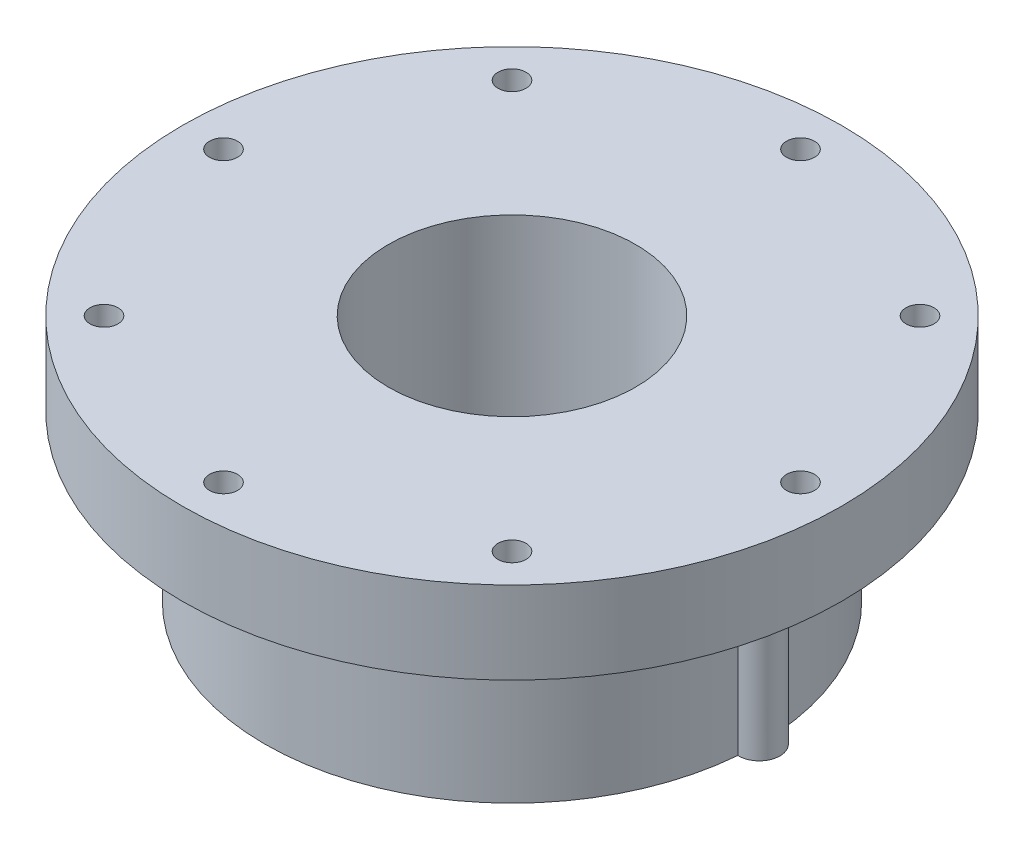
ISO-10303-21;
HEADER;
FILE_DESCRIPTION(('STEP AP214'),'2;1');
FILE_NAME('part.step','',(''),(''),'','','');
FILE_SCHEMA(('AUTOMOTIVE_DESIGN { 1 0 10303 214 1 1 1 1 }'));
ENDSEC;
DATA;
#1=APPLICATION_CONTEXT('core data for automotive mechanical design processes');
#2=APPLICATION_PROTOCOL_DEFINITION('international standard','automotive_design',2000,#1);
#3=PRODUCT_CONTEXT('',#1,'mechanical');
#4=PRODUCT('Part','Part','',(#3));
#5=PRODUCT_RELATED_PRODUCT_CATEGORY('part','',(#4));
#6=PRODUCT_DEFINITION_FORMATION('','',#4);
#7=PRODUCT_DEFINITION_CONTEXT('part definition',#1,'design');
#8=PRODUCT_DEFINITION('design','',#6,#7);
#9=PRODUCT_DEFINITION_SHAPE('','',#8);
#10=(LENGTH_UNIT() NAMED_UNIT(*) SI_UNIT(.MILLI.,.METRE.));
#11=(NAMED_UNIT(*) PLANE_ANGLE_UNIT() SI_UNIT($,.RADIAN.));
#12=(NAMED_UNIT(*) SI_UNIT($,.STERADIAN.) SOLID_ANGLE_UNIT());
#13=UNCERTAINTY_MEASURE_WITH_UNIT(LENGTH_MEASURE(1.E-05),#10,'distance_accuracy_value','');
#14=(GEOMETRIC_REPRESENTATION_CONTEXT(3) GLOBAL_UNCERTAINTY_ASSIGNED_CONTEXT((#13)) GLOBAL_UNIT_ASSIGNED_CONTEXT((#10,
#11,#12)) REPRESENTATION_CONTEXT('',''));
#15=CARTESIAN_POINT('',(0.,0.,0.));
#16=DIRECTION('',(0.,0.,1.));
#17=DIRECTION('',(1.,0.,0.));
#18=AXIS2_PLACEMENT_3D('',#15,#16,#17);
#19=CARTESIAN_POINT('',(15.,-10.,0.));
#20=DIRECTION('',(0.,1.,0.));
#21=DIRECTION('',(0.,0.,1.));
#22=AXIS2_PLACEMENT_3D('',#19,#20,#21);
#23=PLANE('',#22);
#24=CARTESIAN_POINT('',(30.,-10.,0.));
#25=DIRECTION('',(0.,1.,0.));
#26=DIRECTION('',(0.,0.,1.));
#27=AXIS2_PLACEMENT_3D('',#24,#25,#26);
#28=CIRCLE('',#27,2.50000000000004);
#29=CARTESIAN_POINT('',(29.8958333333333,-10.,2.49782891839209));
#30=VERTEX_POINT('',#29);
#31=CARTESIAN_POINT('',(29.8958333333333,-10.,-2.49782891839208));
#32=VERTEX_POINT('',#31);
#33=EDGE_CURVE('E92',#30,#32,#28,.T.);
#34=ORIENTED_EDGE('',*,*,#33,.F.);
#35=CARTESIAN_POINT('',(0.,-10.,0.));
#36=DIRECTION('',(0.,1.,0.));
#37=DIRECTION('',(0.,0.,1.));
#38=AXIS2_PLACEMENT_3D('',#35,#36,#37);
#39=CIRCLE('',#38,30.);
#40=EDGE_CURVE('E66',#32,#30,#39,.T.);
#41=ORIENTED_EDGE('',*,*,#40,.F.);
#42=EDGE_LOOP('',(#34,#41));
#43=FACE_BOUND('',#42,.T.);
#44=CARTESIAN_POINT('',(0.,-10.,0.));
#45=DIRECTION('',(0.,1.,0.));
#46=DIRECTION('',(0.,0.,1.));
#47=AXIS2_PLACEMENT_3D('',#44,#45,#46);
#48=CIRCLE('',#47,15.);
#49=CARTESIAN_POINT('',(0.,-10.,15.));
#50=VERTEX_POINT('',#49);
#51=EDGE_CURVE('E95',#50,#50,#48,.T.);
#52=ORIENTED_EDGE('',*,*,#51,.T.);
#53=EDGE_LOOP('',(#52));
#54=FACE_BOUND('',#53,.T.);
#55=ADVANCED_FACE('F33',(#43,#54),#23,.F.);
#56=CARTESIAN_POINT('',(30.,10.,0.));
#57=DIRECTION('',(0.,-1.,0.));
#58=DIRECTION('',(0.,0.,-1.));
#59=AXIS2_PLACEMENT_3D('',#56,#57,#58);
#60=CYLINDRICAL_SURFACE('',#59,2.50000000000004);
#61=ORIENTED_EDGE('',*,*,#33,.T.);
#62=DIRECTION('',(0.,-1.,0.));
#63=VECTOR('',#62,1.);
#64=CARTESIAN_POINT('',(29.8958333333333,10.,-2.49782891839208));
#65=LINE('',#64,#63);
#66=CARTESIAN_POINT('',(29.8958333333333,10.,-2.49782891839208));
#67=VERTEX_POINT('',#66);
#68=EDGE_CURVE('E41',#67,#32,#65,.T.);
#69=ORIENTED_EDGE('',*,*,#68,.F.);
#70=CARTESIAN_POINT('',(30.,10.,0.));
#71=DIRECTION('',(0.,1.,0.));
#72=DIRECTION('',(0.,0.,1.));
#73=AXIS2_PLACEMENT_3D('',#70,#71,#72);
#74=CIRCLE('',#73,2.50000000000004);
#75=CARTESIAN_POINT('',(31.9,10.,-1.62480768092723));
#76=VERTEX_POINT('',#75);
#77=EDGE_CURVE('E55',#76,#67,#74,.T.);
#78=ORIENTED_EDGE('',*,*,#77,.F.);
#79=CARTESIAN_POINT('',(31.9,10.,1.62480768092723));
#80=VERTEX_POINT('',#79);
#81=EDGE_CURVE('E79',#80,#76,#74,.T.);
#82=ORIENTED_EDGE('',*,*,#81,.F.);
#83=CARTESIAN_POINT('',(29.8958333333333,10.,2.49782891839209));
#84=VERTEX_POINT('',#83);
#85=EDGE_CURVE('E74',#84,#80,#74,.T.);
#86=ORIENTED_EDGE('',*,*,#85,.F.);
#87=DIRECTION('',(0.,-1.,0.));
#88=VECTOR('',#87,1.);
#89=CARTESIAN_POINT('',(29.8958333333333,10.,2.49782891839209));
#90=LINE('',#89,#88);
#91=EDGE_CURVE('E89',#84,#30,#90,.T.);
#92=ORIENTED_EDGE('',*,*,#91,.T.);
#93=EDGE_LOOP('',(#61,#69,#78,#82,#86,#92));
#94=FACE_BOUND('',#93,.T.);
#95=ADVANCED_FACE('F35',(#94),#60,.T.);
#96=CARTESIAN_POINT('',(0.,10.,0.));
#97=DIRECTION('',(0.,-1.,0.));
#98=DIRECTION('',(0.,0.,-1.));
#99=AXIS2_PLACEMENT_3D('',#96,#97,#98);
#100=CYLINDRICAL_SURFACE('',#99,30.);
#101=ORIENTED_EDGE('',*,*,#40,.T.);
#102=ORIENTED_EDGE('',*,*,#91,.F.);
#103=CARTESIAN_POINT('',(0.,10.,0.));
#104=DIRECTION('',(0.,1.,0.));
#105=DIRECTION('',(0.,0.,1.));
#106=AXIS2_PLACEMENT_3D('',#103,#104,#105);
#107=CIRCLE('',#106,30.);
#108=EDGE_CURVE('E88',#67,#84,#107,.T.);
#109=ORIENTED_EDGE('',*,*,#108,.F.);
#110=ORIENTED_EDGE('',*,*,#68,.T.);
#111=EDGE_LOOP('',(#101,#102,#109,#110));
#112=FACE_BOUND('',#111,.T.);
#113=ADVANCED_FACE('F98',(#112),#100,.T.);
#114=CARTESIAN_POINT('',(0.,10.,0.));
#115=DIRECTION('',(0.,-1.,0.));
#116=DIRECTION('',(0.,0.,-1.));
#117=AXIS2_PLACEMENT_3D('',#114,#115,#116);
#118=CYLINDRICAL_SURFACE('',#117,15.);
#119=ORIENTED_EDGE('',*,*,#51,.F.);
#120=EDGE_LOOP('',(#119));
#121=FACE_BOUND('',#120,.T.);
#122=CARTESIAN_POINT('',(0.,20.,0.));
#123=DIRECTION('',(0.,1.,0.));
#124=DIRECTION('',(0.,0.,1.));
#125=AXIS2_PLACEMENT_3D('',#122,#123,#124);
#126=CIRCLE('',#125,15.);
#127=CARTESIAN_POINT('',(0.,20.,15.));
#128=VERTEX_POINT('',#127);
#129=EDGE_CURVE('E111',#128,#128,#126,.T.);
#130=ORIENTED_EDGE('',*,*,#129,.T.);
#131=EDGE_LOOP('',(#130));
#132=FACE_BOUND('',#131,.T.);
#133=ADVANCED_FACE('F258',(#121,#132),#118,.F.);
#134=CARTESIAN_POINT('',(0.,20.,0.));
#135=DIRECTION('',(0.,1.,0.));
#136=DIRECTION('',(0.,0.,1.));
#137=AXIS2_PLACEMENT_3D('',#134,#135,#136);
#138=PLANE('',#137);
#139=CARTESIAN_POINT('',(0.,20.,35.));
#140=DIRECTION('',(0.,1.,0.));
#141=DIRECTION('',(0.,0.,1.));
#142=AXIS2_PLACEMENT_3D('',#139,#140,#141);
#143=CIRCLE('',#142,1.7);
#144=CARTESIAN_POINT('',(0.,20.,36.7));
#145=VERTEX_POINT('',#144);
#146=EDGE_CURVE('E195',#145,#145,#143,.F.);
#147=ORIENTED_EDGE('',*,*,#146,.T.);
#148=EDGE_LOOP('',(#147));
#149=FACE_BOUND('',#148,.T.);
#150=CARTESIAN_POINT('',(24.7487373415292,20.,24.7487373415292));
#151=DIRECTION('',(0.,1.,0.));
#152=DIRECTION('',(0.,0.,1.));
#153=AXIS2_PLACEMENT_3D('',#150,#151,#152);
#154=CIRCLE('',#153,1.69999999999999);
#155=CARTESIAN_POINT('',(24.7487373415292,20.,26.4487373415292));
#156=VERTEX_POINT('',#155);
#157=EDGE_CURVE('E183',#156,#156,#154,.F.);
#158=ORIENTED_EDGE('',*,*,#157,.T.);
#159=EDGE_LOOP('',(#158));
#160=FACE_BOUND('',#159,.T.);
#161=CARTESIAN_POINT('',(35.,20.,0.));
#162=DIRECTION('',(0.,1.,0.));
#163=DIRECTION('',(0.,0.,1.));
#164=AXIS2_PLACEMENT_3D('',#161,#162,#163);
#165=CIRCLE('',#164,1.7);
#166=CARTESIAN_POINT('',(35.,20.,1.69999999999999));
#167=VERTEX_POINT('',#166);
#168=EDGE_CURVE('E80',#167,#167,#165,.F.);
#169=ORIENTED_EDGE('',*,*,#168,.T.);
#170=EDGE_LOOP('',(#169));
#171=FACE_BOUND('',#170,.T.);
#172=CARTESIAN_POINT('',(24.7487373415292,20.,-24.7487373415292));
#173=DIRECTION('',(0.,1.,0.));
#174=DIRECTION('',(0.,0.,1.));
#175=AXIS2_PLACEMENT_3D('',#172,#173,#174);
#176=CIRCLE('',#175,1.69999999999999);
#177=CARTESIAN_POINT('',(24.7487373415292,20.,-23.0487373415292));
#178=VERTEX_POINT('',#177);
#179=EDGE_CURVE('E164',#178,#178,#176,.F.);
#180=ORIENTED_EDGE('',*,*,#179,.T.);
#181=EDGE_LOOP('',(#180));
#182=FACE_BOUND('',#181,.T.);
#183=CARTESIAN_POINT('',(0.,20.,-35.));
#184=DIRECTION('',(0.,1.,0.));
#185=DIRECTION('',(0.,0.,1.));
#186=AXIS2_PLACEMENT_3D('',#183,#184,#185);
#187=CIRCLE('',#186,1.7);
#188=CARTESIAN_POINT('',(0.,20.,-33.3));
#189=VERTEX_POINT('',#188);
#190=EDGE_CURVE('E152',#189,#189,#187,.F.);
#191=ORIENTED_EDGE('',*,*,#190,.T.);
#192=EDGE_LOOP('',(#191));
#193=FACE_BOUND('',#192,.T.);
#194=CARTESIAN_POINT('',(-24.7487373415292,20.,-24.7487373415292));
#195=DIRECTION('',(0.,1.,0.));
#196=DIRECTION('',(0.,0.,1.));
#197=AXIS2_PLACEMENT_3D('',#194,#195,#196);
#198=CIRCLE('',#197,1.7);
#199=CARTESIAN_POINT('',(-24.7487373415292,20.,-23.0487373415292));
#200=VERTEX_POINT('',#199);
#201=EDGE_CURVE('E140',#200,#200,#198,.F.);
#202=ORIENTED_EDGE('',*,*,#201,.T.);
#203=EDGE_LOOP('',(#202));
#204=FACE_BOUND('',#203,.T.);
#205=CARTESIAN_POINT('',(-35.,20.,0.));
#206=DIRECTION('',(0.,1.,0.));
#207=DIRECTION('',(0.,0.,1.));
#208=AXIS2_PLACEMENT_3D('',#205,#206,#207);
#209=CIRCLE('',#208,1.7);
#210=CARTESIAN_POINT('',(-35.,20.,1.7));
#211=VERTEX_POINT('',#210);
#212=EDGE_CURVE('E128',#211,#211,#209,.F.);
#213=ORIENTED_EDGE('',*,*,#212,.T.);
#214=EDGE_LOOP('',(#213));
#215=FACE_BOUND('',#214,.T.);
#216=CARTESIAN_POINT('',(-24.7487373415292,20.,24.7487373415292));
#217=DIRECTION('',(0.,1.,0.));
#218=DIRECTION('',(0.,0.,1.));
#219=AXIS2_PLACEMENT_3D('',#216,#217,#218);
#220=CIRCLE('',#219,1.69999999999999);
#221=CARTESIAN_POINT('',(-24.7487373415292,20.,26.4487373415292));
#222=VERTEX_POINT('',#221);
#223=EDGE_CURVE('E116',#222,#222,#220,.F.);
#224=ORIENTED_EDGE('',*,*,#223,.T.);
#225=EDGE_LOOP('',(#224));
#226=FACE_BOUND('',#225,.T.);
#227=CARTESIAN_POINT('',(0.,20.,0.));
#228=DIRECTION('',(0.,1.,0.));
#229=DIRECTION('',(0.,0.,1.));
#230=AXIS2_PLACEMENT_3D('',#227,#228,#229);
#231=CIRCLE('',#230,40.);
#232=CARTESIAN_POINT('',(0.,20.,40.));
#233=VERTEX_POINT('',#232);
#234=EDGE_CURVE('E105',#233,#233,#231,.T.);
#235=ORIENTED_EDGE('',*,*,#234,.T.);
#236=EDGE_LOOP('',(#235));
#237=FACE_BOUND('',#236,.T.);
#238=ORIENTED_EDGE('',*,*,#129,.F.);
#239=EDGE_LOOP('',(#238));
#240=FACE_BOUND('',#239,.T.);
#241=ADVANCED_FACE('F224',(#149,#160,#171,#182,#193,#204,#215,#226,#237,#240),#138,.T.);
#242=CARTESIAN_POINT('',(0.,10.,0.));
#243=DIRECTION('',(0.,1.,0.));
#244=DIRECTION('',(0.,0.,1.));
#245=AXIS2_PLACEMENT_3D('',#242,#243,#244);
#246=PLANE('',#245);
#247=CARTESIAN_POINT('',(0.,10.,35.));
#248=DIRECTION('',(0.,-1.,0.));
#249=DIRECTION('',(0.,0.,-1.));
#250=AXIS2_PLACEMENT_3D('',#247,#248,#249);
#251=CIRCLE('',#250,3.5);
#252=CARTESIAN_POINT('',(0.,10.,31.5));
#253=VERTEX_POINT('',#252);
#254=EDGE_CURVE('E199',#253,#253,#251,.T.);
#255=ORIENTED_EDGE('',*,*,#254,.F.);
#256=EDGE_LOOP('',(#255));
#257=FACE_BOUND('',#256,.T.);
#258=CARTESIAN_POINT('',(24.7487373415292,10.,24.7487373415292));
#259=DIRECTION('',(0.,-1.,0.));
#260=DIRECTION('',(0.,0.,-1.));
#261=AXIS2_PLACEMENT_3D('',#258,#259,#260);
#262=CIRCLE('',#261,3.5);
#263=CARTESIAN_POINT('',(24.7487373415292,10.,21.2487373415292));
#264=VERTEX_POINT('',#263);
#265=EDGE_CURVE('E187',#264,#264,#262,.T.);
#266=ORIENTED_EDGE('',*,*,#265,.F.);
#267=EDGE_LOOP('',(#266));
#268=FACE_BOUND('',#267,.T.);
#269=CARTESIAN_POINT('',(24.7487373415292,10.,-24.7487373415292));
#270=DIRECTION('',(0.,-1.,0.));
#271=DIRECTION('',(0.,0.,-1.));
#272=AXIS2_PLACEMENT_3D('',#269,#270,#271);
#273=CIRCLE('',#272,3.5);
#274=CARTESIAN_POINT('',(24.7487373415292,10.,-28.2487373415292));
#275=VERTEX_POINT('',#274);
#276=EDGE_CURVE('E168',#275,#275,#273,.T.);
#277=ORIENTED_EDGE('',*,*,#276,.F.);
#278=EDGE_LOOP('',(#277));
#279=FACE_BOUND('',#278,.T.);
#280=CARTESIAN_POINT('',(0.,10.,-35.));
#281=DIRECTION('',(0.,-1.,0.));
#282=DIRECTION('',(0.,0.,-1.));
#283=AXIS2_PLACEMENT_3D('',#280,#281,#282);
#284=CIRCLE('',#283,3.5);
#285=CARTESIAN_POINT('',(0.,10.,-38.5));
#286=VERTEX_POINT('',#285);
#287=EDGE_CURVE('E156',#286,#286,#284,.T.);
#288=ORIENTED_EDGE('',*,*,#287,.F.);
#289=EDGE_LOOP('',(#288));
#290=FACE_BOUND('',#289,.T.);
#291=CARTESIAN_POINT('',(-24.7487373415292,10.,-24.7487373415292));
#292=DIRECTION('',(0.,-1.,0.));
#293=DIRECTION('',(0.,0.,-1.));
#294=AXIS2_PLACEMENT_3D('',#291,#292,#293);
#295=CIRCLE('',#294,3.5);
#296=CARTESIAN_POINT('',(-24.7487373415292,10.,-28.2487373415292));
#297=VERTEX_POINT('',#296);
#298=EDGE_CURVE('E144',#297,#297,#295,.T.);
#299=ORIENTED_EDGE('',*,*,#298,.F.);
#300=EDGE_LOOP('',(#299));
#301=FACE_BOUND('',#300,.T.);
#302=CARTESIAN_POINT('',(-35.,10.,0.));
#303=DIRECTION('',(0.,-1.,0.));
#304=DIRECTION('',(0.,0.,-1.));
#305=AXIS2_PLACEMENT_3D('',#302,#303,#304);
#306=CIRCLE('',#305,3.5);
#307=CARTESIAN_POINT('',(-35.,10.,-3.5));
#308=VERTEX_POINT('',#307);
#309=EDGE_CURVE('E132',#308,#308,#306,.T.);
#310=ORIENTED_EDGE('',*,*,#309,.F.);
#311=EDGE_LOOP('',(#310));
#312=FACE_BOUND('',#311,.T.);
#313=CARTESIAN_POINT('',(-24.7487373415292,10.,24.7487373415292));
#314=DIRECTION('',(0.,-1.,0.));
#315=DIRECTION('',(0.,0.,-1.));
#316=AXIS2_PLACEMENT_3D('',#313,#314,#315);
#317=CIRCLE('',#316,3.5);
#318=CARTESIAN_POINT('',(-24.7487373415292,10.,21.2487373415292));
#319=VERTEX_POINT('',#318);
#320=EDGE_CURVE('E120',#319,#319,#317,.T.);
#321=ORIENTED_EDGE('',*,*,#320,.F.);
#322=EDGE_LOOP('',(#321));
#323=FACE_BOUND('',#322,.T.);
#324=ORIENTED_EDGE('',*,*,#85,.T.);
#325=CARTESIAN_POINT('',(35.,10.,0.));
#326=DIRECTION('',(0.,1.,0.));
#327=DIRECTION('',(0.,0.,1.));
#328=AXIS2_PLACEMENT_3D('',#325,#326,#327);
#329=CIRCLE('',#328,3.5);
#330=EDGE_CURVE('E11',#80,#76,#329,.T.);
#331=ORIENTED_EDGE('',*,*,#330,.T.);
#332=ORIENTED_EDGE('',*,*,#77,.T.);
#333=ORIENTED_EDGE('',*,*,#108,.T.);
#334=EDGE_LOOP('',(#324,#331,#332,#333));
#335=FACE_BOUND('',#334,.T.);
#336=CARTESIAN_POINT('',(0.,10.,0.));
#337=DIRECTION('',(0.,1.,0.));
#338=DIRECTION('',(0.,0.,1.));
#339=AXIS2_PLACEMENT_3D('',#336,#337,#338);
#340=CIRCLE('',#339,40.);
#341=CARTESIAN_POINT('',(0.,10.,40.));
#342=VERTEX_POINT('',#341);
#343=EDGE_CURVE('E107',#342,#342,#340,.T.);
#344=ORIENTED_EDGE('',*,*,#343,.F.);
#345=EDGE_LOOP('',(#344));
#346=FACE_BOUND('',#345,.T.);
#347=ADVANCED_FACE('F86',(#257,#268,#279,#290,#301,#312,#323,#335,#346),#246,.F.);
#348=CARTESIAN_POINT('',(0.,20.,0.));
#349=DIRECTION('',(0.,-1.,0.));
#350=DIRECTION('',(0.,0.,-1.));
#351=AXIS2_PLACEMENT_3D('',#348,#349,#350);
#352=CYLINDRICAL_SURFACE('',#351,40.);
#353=ORIENTED_EDGE('',*,*,#234,.F.);
#354=EDGE_LOOP('',(#353));
#355=FACE_BOUND('',#354,.T.);
#356=ORIENTED_EDGE('',*,*,#343,.T.);
#357=EDGE_LOOP('',(#356));
#358=FACE_BOUND('',#357,.T.);
#359=ADVANCED_FACE('F223',(#355,#358),#352,.T.);
#360=CARTESIAN_POINT('',(-24.7487373415292,10.,24.7487373415292));
#361=DIRECTION('',(0.,-1.,0.));
#362=DIRECTION('',(0.,0.,-1.));
#363=AXIS2_PLACEMENT_3D('',#360,#361,#362);
#364=CYLINDRICAL_SURFACE('',#363,1.69999999999999);
#365=ORIENTED_EDGE('',*,*,#223,.F.);
#366=EDGE_LOOP('',(#365));
#367=FACE_BOUND('',#366,.T.);
#368=CARTESIAN_POINT('',(-24.7487373415292,12.4,24.7487373415292));
#369=DIRECTION('',(0.,-1.,0.));
#370=DIRECTION('',(0.,0.,-1.));
#371=AXIS2_PLACEMENT_3D('',#368,#369,#370);
#372=CIRCLE('',#371,1.69999999999999);
#373=CARTESIAN_POINT('',(-24.7487373415292,12.4,23.0487373415292));
#374=VERTEX_POINT('',#373);
#375=EDGE_CURVE('E119',#374,#374,#372,.T.);
#376=ORIENTED_EDGE('',*,*,#375,.T.);
#377=EDGE_LOOP('',(#376));
#378=FACE_BOUND('',#377,.T.);
#379=ADVANCED_FACE('F251',(#367,#378),#364,.F.);
#380=CARTESIAN_POINT('',(-23.0487373415292,12.4,24.7487373415292));
#381=DIRECTION('',(0.,1.,0.));
#382=DIRECTION('',(0.,0.,1.));
#383=AXIS2_PLACEMENT_3D('',#380,#381,#382);
#384=PLANE('',#383);
#385=ORIENTED_EDGE('',*,*,#375,.F.);
#386=EDGE_LOOP('',(#385));
#387=FACE_BOUND('',#386,.T.);
#388=CARTESIAN_POINT('',(-24.7487373415292,12.4,24.7487373415292));
#389=DIRECTION('',(0.,-1.,0.));
#390=DIRECTION('',(0.,0.,-1.));
#391=AXIS2_PLACEMENT_3D('',#388,#389,#390);
#392=CIRCLE('',#391,3.5);
#393=CARTESIAN_POINT('',(-24.7487373415292,12.4,21.2487373415292));
#394=VERTEX_POINT('',#393);
#395=EDGE_CURVE('E115',#394,#394,#392,.T.);
#396=ORIENTED_EDGE('',*,*,#395,.T.);
#397=EDGE_LOOP('',(#396));
#398=FACE_BOUND('',#397,.T.);
#399=ADVANCED_FACE('F241',(#387,#398),#384,.F.);
#400=CARTESIAN_POINT('',(-24.7487373415292,10.,24.7487373415292));
#401=DIRECTION('',(0.,-1.,0.));
#402=DIRECTION('',(0.,0.,-1.));
#403=AXIS2_PLACEMENT_3D('',#400,#401,#402);
#404=CYLINDRICAL_SURFACE('',#403,3.5);
#405=ORIENTED_EDGE('',*,*,#395,.F.);
#406=EDGE_LOOP('',(#405));
#407=FACE_BOUND('',#406,.T.);
#408=ORIENTED_EDGE('',*,*,#320,.T.);
#409=EDGE_LOOP('',(#408));
#410=FACE_BOUND('',#409,.T.);
#411=ADVANCED_FACE('F238',(#407,#410),#404,.F.);
#412=CARTESIAN_POINT('',(-35.,10.,0.));
#413=DIRECTION('',(0.,-1.,0.));
#414=DIRECTION('',(0.,0.,-1.));
#415=AXIS2_PLACEMENT_3D('',#412,#413,#414);
#416=CYLINDRICAL_SURFACE('',#415,1.7);
#417=ORIENTED_EDGE('',*,*,#212,.F.);
#418=EDGE_LOOP('',(#417));
#419=FACE_BOUND('',#418,.T.);
#420=CARTESIAN_POINT('',(-35.,12.4,0.));
#421=DIRECTION('',(0.,-1.,0.));
#422=DIRECTION('',(0.,0.,-1.));
#423=AXIS2_PLACEMENT_3D('',#420,#421,#422);
#424=CIRCLE('',#423,1.69999999999999);
#425=CARTESIAN_POINT('',(-35.,12.4,-1.69999999999999));
#426=VERTEX_POINT('',#425);
#427=EDGE_CURVE('E131',#426,#426,#424,.T.);
#428=ORIENTED_EDGE('',*,*,#427,.T.);
#429=EDGE_LOOP('',(#428));
#430=FACE_BOUND('',#429,.T.);
#431=ADVANCED_FACE('F240',(#419,#430),#416,.F.);
#432=CARTESIAN_POINT('',(-33.3,12.4,0.));
#433=DIRECTION('',(0.,1.,0.));
#434=DIRECTION('',(0.,0.,1.));
#435=AXIS2_PLACEMENT_3D('',#432,#433,#434);
#436=PLANE('',#435);
#437=ORIENTED_EDGE('',*,*,#427,.F.);
#438=EDGE_LOOP('',(#437));
#439=FACE_BOUND('',#438,.T.);
#440=CARTESIAN_POINT('',(-35.,12.4,0.));
#441=DIRECTION('',(0.,-1.,0.));
#442=DIRECTION('',(0.,0.,-1.));
#443=AXIS2_PLACEMENT_3D('',#440,#441,#442);
#444=CIRCLE('',#443,3.5);
#445=CARTESIAN_POINT('',(-35.,12.4,-3.5));
#446=VERTEX_POINT('',#445);
#447=EDGE_CURVE('E123',#446,#446,#444,.T.);
#448=ORIENTED_EDGE('',*,*,#447,.T.);
#449=EDGE_LOOP('',(#448));
#450=FACE_BOUND('',#449,.T.);
#451=ADVANCED_FACE('F248',(#439,#450),#436,.F.);
#452=CARTESIAN_POINT('',(-35.,10.,0.));
#453=DIRECTION('',(0.,-1.,0.));
#454=DIRECTION('',(0.,0.,-1.));
#455=AXIS2_PLACEMENT_3D('',#452,#453,#454);
#456=CYLINDRICAL_SURFACE('',#455,3.5);
#457=ORIENTED_EDGE('',*,*,#447,.F.);
#458=EDGE_LOOP('',(#457));
#459=FACE_BOUND('',#458,.T.);
#460=ORIENTED_EDGE('',*,*,#309,.T.);
#461=EDGE_LOOP('',(#460));
#462=FACE_BOUND('',#461,.T.);
#463=ADVANCED_FACE('F328',(#459,#462),#456,.F.);
#464=CARTESIAN_POINT('',(-24.7487373415292,10.,-24.7487373415292));
#465=DIRECTION('',(0.,-1.,0.));
#466=DIRECTION('',(0.,0.,-1.));
#467=AXIS2_PLACEMENT_3D('',#464,#465,#466);
#468=CYLINDRICAL_SURFACE('',#467,1.7);
#469=ORIENTED_EDGE('',*,*,#201,.F.);
#470=EDGE_LOOP('',(#469));
#471=FACE_BOUND('',#470,.T.);
#472=CARTESIAN_POINT('',(-24.7487373415292,12.4,-24.7487373415292));
#473=DIRECTION('',(0.,-1.,0.));
#474=DIRECTION('',(0.,0.,-1.));
#475=AXIS2_PLACEMENT_3D('',#472,#473,#474);
#476=CIRCLE('',#475,1.7);
#477=CARTESIAN_POINT('',(-24.7487373415292,12.4,-26.4487373415292));
#478=VERTEX_POINT('',#477);
#479=EDGE_CURVE('E143',#478,#478,#476,.T.);
#480=ORIENTED_EDGE('',*,*,#479,.T.);
#481=EDGE_LOOP('',(#480));
#482=FACE_BOUND('',#481,.T.);
#483=ADVANCED_FACE('F338',(#471,#482),#468,.F.);
#484=CARTESIAN_POINT('',(-23.0487373415292,12.4,-24.7487373415292));
#485=DIRECTION('',(0.,1.,0.));
#486=DIRECTION('',(0.,0.,1.));
#487=AXIS2_PLACEMENT_3D('',#484,#485,#486);
#488=PLANE('',#487);
#489=ORIENTED_EDGE('',*,*,#479,.F.);
#490=EDGE_LOOP('',(#489));
#491=FACE_BOUND('',#490,.T.);
#492=CARTESIAN_POINT('',(-24.7487373415292,12.4,-24.7487373415292));
#493=DIRECTION('',(0.,-1.,0.));
#494=DIRECTION('',(0.,0.,-1.));
#495=AXIS2_PLACEMENT_3D('',#492,#493,#494);
#496=CIRCLE('',#495,3.5);
#497=CARTESIAN_POINT('',(-24.7487373415292,12.4,-28.2487373415292));
#498=VERTEX_POINT('',#497);
#499=EDGE_CURVE('E135',#498,#498,#496,.T.);
#500=ORIENTED_EDGE('',*,*,#499,.T.);
#501=EDGE_LOOP('',(#500));
#502=FACE_BOUND('',#501,.T.);
#503=ADVANCED_FACE('F348',(#491,#502),#488,.F.);
#504=CARTESIAN_POINT('',(-24.7487373415292,10.,-24.7487373415292));
#505=DIRECTION('',(0.,-1.,0.));
#506=DIRECTION('',(0.,0.,-1.));
#507=AXIS2_PLACEMENT_3D('',#504,#505,#506);
#508=CYLINDRICAL_SURFACE('',#507,3.5);
#509=ORIENTED_EDGE('',*,*,#499,.F.);
#510=EDGE_LOOP('',(#509));
#511=FACE_BOUND('',#510,.T.);
#512=ORIENTED_EDGE('',*,*,#298,.T.);
#513=EDGE_LOOP('',(#512));
#514=FACE_BOUND('',#513,.T.);
#515=ADVANCED_FACE('F358',(#511,#514),#508,.F.);
#516=CARTESIAN_POINT('',(0.,10.,-35.));
#517=DIRECTION('',(0.,-1.,0.));
#518=DIRECTION('',(0.,0.,-1.));
#519=AXIS2_PLACEMENT_3D('',#516,#517,#518);
#520=CYLINDRICAL_SURFACE('',#519,1.7);
#521=ORIENTED_EDGE('',*,*,#190,.F.);
#522=EDGE_LOOP('',(#521));
#523=FACE_BOUND('',#522,.T.);
#524=CARTESIAN_POINT('',(0.,12.4,-35.));
#525=DIRECTION('',(0.,-1.,0.));
#526=DIRECTION('',(0.,0.,-1.));
#527=AXIS2_PLACEMENT_3D('',#524,#525,#526);
#528=CIRCLE('',#527,1.69999999999999);
#529=CARTESIAN_POINT('',(0.,12.4,-36.7));
#530=VERTEX_POINT('',#529);
#531=EDGE_CURVE('E155',#530,#530,#528,.T.);
#532=ORIENTED_EDGE('',*,*,#531,.T.);
#533=EDGE_LOOP('',(#532));
#534=FACE_BOUND('',#533,.T.);
#535=ADVANCED_FACE('F368',(#523,#534),#520,.F.);
#536=CARTESIAN_POINT('',(1.69999999999999,12.4,-35.));
#537=DIRECTION('',(0.,1.,0.));
#538=DIRECTION('',(0.,0.,1.));
#539=AXIS2_PLACEMENT_3D('',#536,#537,#538);
#540=PLANE('',#539);
#541=ORIENTED_EDGE('',*,*,#531,.F.);
#542=EDGE_LOOP('',(#541));
#543=FACE_BOUND('',#542,.T.);
#544=CARTESIAN_POINT('',(0.,12.4,-35.));
#545=DIRECTION('',(0.,-1.,0.));
#546=DIRECTION('',(0.,0.,-1.));
#547=AXIS2_PLACEMENT_3D('',#544,#545,#546);
#548=CIRCLE('',#547,3.5);
#549=CARTESIAN_POINT('',(0.,12.4,-38.5));
#550=VERTEX_POINT('',#549);
#551=EDGE_CURVE('E147',#550,#550,#548,.T.);
#552=ORIENTED_EDGE('',*,*,#551,.T.);
#553=EDGE_LOOP('',(#552));
#554=FACE_BOUND('',#553,.T.);
#555=ADVANCED_FACE('F378',(#543,#554),#540,.F.);
#556=CARTESIAN_POINT('',(0.,10.,-35.));
#557=DIRECTION('',(0.,-1.,0.));
#558=DIRECTION('',(0.,0.,-1.));
#559=AXIS2_PLACEMENT_3D('',#556,#557,#558);
#560=CYLINDRICAL_SURFACE('',#559,3.5);
#561=ORIENTED_EDGE('',*,*,#551,.F.);
#562=EDGE_LOOP('',(#561));
#563=FACE_BOUND('',#562,.T.);
#564=ORIENTED_EDGE('',*,*,#287,.T.);
#565=EDGE_LOOP('',(#564));
#566=FACE_BOUND('',#565,.T.);
#567=ADVANCED_FACE('F388',(#563,#566),#560,.F.);
#568=CARTESIAN_POINT('',(24.7487373415292,10.,-24.7487373415292));
#569=DIRECTION('',(0.,-1.,0.));
#570=DIRECTION('',(0.,0.,-1.));
#571=AXIS2_PLACEMENT_3D('',#568,#569,#570);
#572=CYLINDRICAL_SURFACE('',#571,1.69999999999999);
#573=ORIENTED_EDGE('',*,*,#179,.F.);
#574=EDGE_LOOP('',(#573));
#575=FACE_BOUND('',#574,.T.);
#576=CARTESIAN_POINT('',(24.7487373415292,12.4,-24.7487373415292));
#577=DIRECTION('',(0.,-1.,0.));
#578=DIRECTION('',(0.,0.,-1.));
#579=AXIS2_PLACEMENT_3D('',#576,#577,#578);
#580=CIRCLE('',#579,1.69999999999999);
#581=CARTESIAN_POINT('',(24.7487373415292,12.4,-26.4487373415292));
#582=VERTEX_POINT('',#581);
#583=EDGE_CURVE('E167',#582,#582,#580,.T.);
#584=ORIENTED_EDGE('',*,*,#583,.T.);
#585=EDGE_LOOP('',(#584));
#586=FACE_BOUND('',#585,.T.);
#587=ADVANCED_FACE('F398',(#575,#586),#572,.F.);
#588=CARTESIAN_POINT('',(26.4487373415292,12.4,-24.7487373415292));
#589=DIRECTION('',(0.,1.,0.));
#590=DIRECTION('',(0.,0.,1.));
#591=AXIS2_PLACEMENT_3D('',#588,#589,#590);
#592=PLANE('',#591);
#593=ORIENTED_EDGE('',*,*,#583,.F.);
#594=EDGE_LOOP('',(#593));
#595=FACE_BOUND('',#594,.T.);
#596=CARTESIAN_POINT('',(24.7487373415292,12.4,-24.7487373415292));
#597=DIRECTION('',(0.,-1.,0.));
#598=DIRECTION('',(0.,0.,-1.));
#599=AXIS2_PLACEMENT_3D('',#596,#597,#598);
#600=CIRCLE('',#599,3.5);
#601=CARTESIAN_POINT('',(24.7487373415292,12.4,-28.2487373415292));
#602=VERTEX_POINT('',#601);
#603=EDGE_CURVE('E159',#602,#602,#600,.T.);
#604=ORIENTED_EDGE('',*,*,#603,.T.);
#605=EDGE_LOOP('',(#604));
#606=FACE_BOUND('',#605,.T.);
#607=ADVANCED_FACE('F408',(#595,#606),#592,.F.);
#608=CARTESIAN_POINT('',(24.7487373415292,10.,-24.7487373415292));
#609=DIRECTION('',(0.,-1.,0.));
#610=DIRECTION('',(0.,0.,-1.));
#611=AXIS2_PLACEMENT_3D('',#608,#609,#610);
#612=CYLINDRICAL_SURFACE('',#611,3.5);
#613=ORIENTED_EDGE('',*,*,#603,.F.);
#614=EDGE_LOOP('',(#613));
#615=FACE_BOUND('',#614,.T.);
#616=ORIENTED_EDGE('',*,*,#276,.T.);
#617=EDGE_LOOP('',(#616));
#618=FACE_BOUND('',#617,.T.);
#619=ADVANCED_FACE('F418',(#615,#618),#612,.F.);
#620=CARTESIAN_POINT('',(38.5,10.,0.));
#621=DIRECTION('',(0.,-1.,0.));
#622=DIRECTION('',(0.,0.,-1.));
#623=AXIS2_PLACEMENT_3D('',#620,#621,#622);
#624=PLANE('',#623);
#625=ORIENTED_EDGE('',*,*,#81,.T.);
#626=CARTESIAN_POINT('',(35.,10.,0.));
#627=DIRECTION('',(0.,-1.,0.));
#628=DIRECTION('',(0.,0.,-1.));
#629=AXIS2_PLACEMENT_3D('',#626,#627,#628);
#630=CIRCLE('',#629,3.5);
#631=EDGE_CURVE('E47',#80,#76,#630,.T.);
#632=ORIENTED_EDGE('',*,*,#631,.F.);
#633=EDGE_LOOP('',(#625,#632));
#634=FACE_BOUND('',#633,.T.);
#635=ADVANCED_FACE('F78',(#634),#624,.F.);
#636=CARTESIAN_POINT('',(35.,10.,0.));
#637=DIRECTION('',(0.,-1.,0.));
#638=DIRECTION('',(0.,0.,-1.));
#639=AXIS2_PLACEMENT_3D('',#636,#637,#638);
#640=CYLINDRICAL_SURFACE('',#639,1.7);
#641=ORIENTED_EDGE('',*,*,#168,.F.);
#642=EDGE_LOOP('',(#641));
#643=FACE_BOUND('',#642,.T.);
#644=CARTESIAN_POINT('',(35.,12.4,0.));
#645=DIRECTION('',(0.,-1.,0.));
#646=DIRECTION('',(0.,0.,-1.));
#647=AXIS2_PLACEMENT_3D('',#644,#645,#646);
#648=CIRCLE('',#647,1.69999999999999);
#649=CARTESIAN_POINT('',(35.,12.4,-1.7));
#650=VERTEX_POINT('',#649);
#651=EDGE_CURVE('E177',#650,#650,#648,.T.);
#652=ORIENTED_EDGE('',*,*,#651,.T.);
#653=EDGE_LOOP('',(#652));
#654=FACE_BOUND('',#653,.T.);
#655=ADVANCED_FACE('F437',(#643,#654),#640,.F.);
#656=CARTESIAN_POINT('',(36.7,12.4,0.));
#657=DIRECTION('',(0.,1.,0.));
#658=DIRECTION('',(0.,0.,1.));
#659=AXIS2_PLACEMENT_3D('',#656,#657,#658);
#660=PLANE('',#659);
#661=ORIENTED_EDGE('',*,*,#651,.F.);
#662=EDGE_LOOP('',(#661));
#663=FACE_BOUND('',#662,.T.);
#664=CARTESIAN_POINT('',(35.,12.4,0.));
#665=DIRECTION('',(0.,-1.,0.));
#666=DIRECTION('',(0.,0.,-1.));
#667=AXIS2_PLACEMENT_3D('',#664,#665,#666);
#668=CIRCLE('',#667,3.5);
#669=CARTESIAN_POINT('',(35.,12.4,-3.5));
#670=VERTEX_POINT('',#669);
#671=EDGE_CURVE('E171',#670,#670,#668,.T.);
#672=ORIENTED_EDGE('',*,*,#671,.T.);
#673=EDGE_LOOP('',(#672));
#674=FACE_BOUND('',#673,.T.);
#675=ADVANCED_FACE('F446',(#663,#674),#660,.F.);
#676=CARTESIAN_POINT('',(35.,10.,0.));
#677=DIRECTION('',(0.,-1.,0.));
#678=DIRECTION('',(0.,0.,-1.));
#679=AXIS2_PLACEMENT_3D('',#676,#677,#678);
#680=CYLINDRICAL_SURFACE('',#679,3.5);
#681=ORIENTED_EDGE('',*,*,#671,.F.);
#682=EDGE_LOOP('',(#681));
#683=FACE_BOUND('',#682,.T.);
#684=ORIENTED_EDGE('',*,*,#631,.T.);
#685=ORIENTED_EDGE('',*,*,#330,.F.);
#686=EDGE_LOOP('',(#684,#685));
#687=FACE_BOUND('',#686,.T.);
#688=ADVANCED_FACE('F76',(#683,#687),#680,.F.);
#689=CARTESIAN_POINT('',(24.7487373415292,10.,24.7487373415292));
#690=DIRECTION('',(0.,-1.,0.));
#691=DIRECTION('',(0.,0.,-1.));
#692=AXIS2_PLACEMENT_3D('',#689,#690,#691);
#693=CYLINDRICAL_SURFACE('',#692,1.69999999999999);
#694=ORIENTED_EDGE('',*,*,#157,.F.);
#695=EDGE_LOOP('',(#694));
#696=FACE_BOUND('',#695,.T.);
#697=CARTESIAN_POINT('',(24.7487373415292,12.4,24.7487373415292));
#698=DIRECTION('',(0.,-1.,0.));
#699=DIRECTION('',(0.,0.,-1.));
#700=AXIS2_PLACEMENT_3D('',#697,#698,#699);
#701=CIRCLE('',#700,1.69999999999999);
#702=CARTESIAN_POINT('',(24.7487373415292,12.4,23.0487373415292));
#703=VERTEX_POINT('',#702);
#704=EDGE_CURVE('E186',#703,#703,#701,.T.);
#705=ORIENTED_EDGE('',*,*,#704,.T.);
#706=EDGE_LOOP('',(#705));
#707=FACE_BOUND('',#706,.T.);
#708=ADVANCED_FACE('F465',(#696,#707),#693,.F.);
#709=CARTESIAN_POINT('',(26.4487373415292,12.4,24.7487373415292));
#710=DIRECTION('',(0.,1.,0.));
#711=DIRECTION('',(0.,0.,1.));
#712=AXIS2_PLACEMENT_3D('',#709,#710,#711);
#713=PLANE('',#712);
#714=ORIENTED_EDGE('',*,*,#704,.F.);
#715=EDGE_LOOP('',(#714));
#716=FACE_BOUND('',#715,.T.);
#717=CARTESIAN_POINT('',(24.7487373415292,12.4,24.7487373415292));
#718=DIRECTION('',(0.,-1.,0.));
#719=DIRECTION('',(0.,0.,-1.));
#720=AXIS2_PLACEMENT_3D('',#717,#718,#719);
#721=CIRCLE('',#720,3.5);
#722=CARTESIAN_POINT('',(24.7487373415292,12.4,21.2487373415292));
#723=VERTEX_POINT('',#722);
#724=EDGE_CURVE('E81',#723,#723,#721,.T.);
#725=ORIENTED_EDGE('',*,*,#724,.T.);
#726=EDGE_LOOP('',(#725));
#727=FACE_BOUND('',#726,.T.);
#728=ADVANCED_FACE('F475',(#716,#727),#713,.F.);
#729=CARTESIAN_POINT('',(24.7487373415292,10.,24.7487373415292));
#730=DIRECTION('',(0.,-1.,0.));
#731=DIRECTION('',(0.,0.,-1.));
#732=AXIS2_PLACEMENT_3D('',#729,#730,#731);
#733=CYLINDRICAL_SURFACE('',#732,3.5);
#734=ORIENTED_EDGE('',*,*,#724,.F.);
#735=EDGE_LOOP('',(#734));
#736=FACE_BOUND('',#735,.T.);
#737=ORIENTED_EDGE('',*,*,#265,.T.);
#738=EDGE_LOOP('',(#737));
#739=FACE_BOUND('',#738,.T.);
#740=ADVANCED_FACE('F485',(#736,#739),#733,.F.);
#741=CARTESIAN_POINT('',(0.,10.,35.));
#742=DIRECTION('',(0.,-1.,0.));
#743=DIRECTION('',(0.,0.,-1.));
#744=AXIS2_PLACEMENT_3D('',#741,#742,#743);
#745=CYLINDRICAL_SURFACE('',#744,1.7);
#746=ORIENTED_EDGE('',*,*,#146,.F.);
#747=EDGE_LOOP('',(#746));
#748=FACE_BOUND('',#747,.T.);
#749=CARTESIAN_POINT('',(0.,12.4,35.));
#750=DIRECTION('',(0.,-1.,0.));
#751=DIRECTION('',(0.,0.,-1.));
#752=AXIS2_PLACEMENT_3D('',#749,#750,#751);
#753=CIRCLE('',#752,1.69999999999999);
#754=CARTESIAN_POINT('',(0.,12.4,33.3));
#755=VERTEX_POINT('',#754);
#756=EDGE_CURVE('E198',#755,#755,#753,.T.);
#757=ORIENTED_EDGE('',*,*,#756,.T.);
#758=EDGE_LOOP('',(#757));
#759=FACE_BOUND('',#758,.T.);
#760=ADVANCED_FACE('F207',(#748,#759),#745,.F.);
#761=CARTESIAN_POINT('',(1.69999999999999,12.4,35.));
#762=DIRECTION('',(0.,1.,0.));
#763=DIRECTION('',(0.,0.,1.));
#764=AXIS2_PLACEMENT_3D('',#761,#762,#763);
#765=PLANE('',#764);
#766=ORIENTED_EDGE('',*,*,#756,.F.);
#767=EDGE_LOOP('',(#766));
#768=FACE_BOUND('',#767,.T.);
#769=CARTESIAN_POINT('',(0.,12.4,35.));
#770=DIRECTION('',(0.,-1.,0.));
#771=DIRECTION('',(0.,0.,-1.));
#772=AXIS2_PLACEMENT_3D('',#769,#770,#771);
#773=CIRCLE('',#772,3.5);
#774=CARTESIAN_POINT('',(0.,12.4,31.5));
#775=VERTEX_POINT('',#774);
#776=EDGE_CURVE('E190',#775,#775,#773,.T.);
#777=ORIENTED_EDGE('',*,*,#776,.T.);
#778=EDGE_LOOP('',(#777));
#779=FACE_BOUND('',#778,.T.);
#780=ADVANCED_FACE('F209',(#768,#779),#765,.F.);
#781=CARTESIAN_POINT('',(0.,10.,35.));
#782=DIRECTION('',(0.,-1.,0.));
#783=DIRECTION('',(0.,0.,-1.));
#784=AXIS2_PLACEMENT_3D('',#781,#782,#783);
#785=CYLINDRICAL_SURFACE('',#784,3.5);
#786=ORIENTED_EDGE('',*,*,#776,.F.);
#787=EDGE_LOOP('',(#786));
#788=FACE_BOUND('',#787,.T.);
#789=ORIENTED_EDGE('',*,*,#254,.T.);
#790=EDGE_LOOP('',(#789));
#791=FACE_BOUND('',#790,.T.);
#792=ADVANCED_FACE('F212',(#788,#791),#785,.F.);
#793=CLOSED_SHELL('',(#55,#95,#113,#133,#241,#347,#359,#379,#399,#411,#431,#451,#463,#483,#503,
#515,#535,#555,#567,#587,#607,#619,#635,#655,#675,#688,#708,#728,#740,#760,#780,#792));
#794=MANIFOLD_SOLID_BREP('B2',#793);
#795=ADVANCED_BREP_SHAPE_REPRESENTATION('',(#18,#794),#14);
#796=SHAPE_DEFINITION_REPRESENTATION(#9,#795);
ENDSEC;
END-ISO-10303-21;
